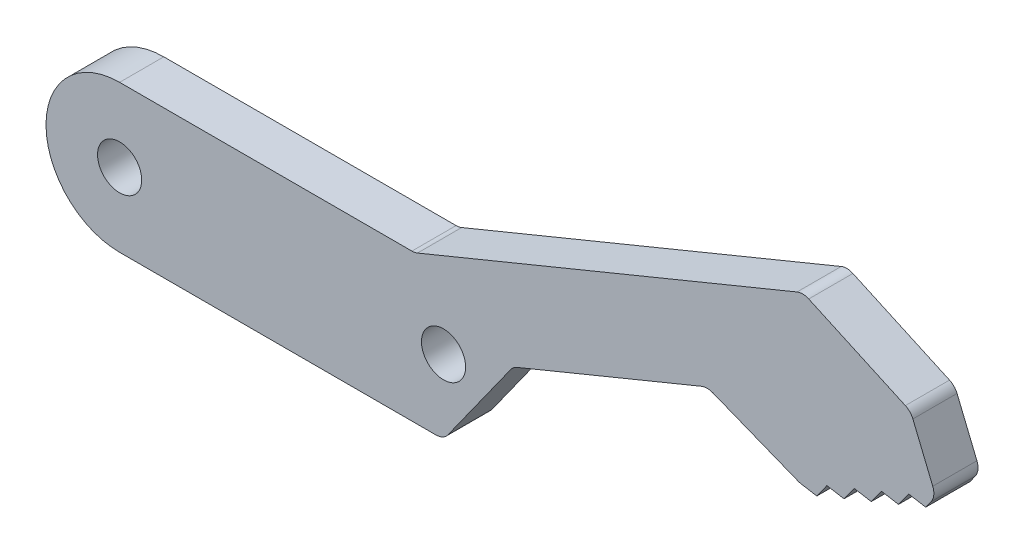
ISO-10303-21;
HEADER;
FILE_DESCRIPTION(('STEP AP214'),'2;1');
FILE_NAME('part.step','',(''),(''),'','','');
FILE_SCHEMA(('AUTOMOTIVE_DESIGN { 1 0 10303 214 1 1 1 1 }'));
ENDSEC;
DATA;
#1=APPLICATION_CONTEXT('core data for automotive mechanical design processes');
#2=APPLICATION_PROTOCOL_DEFINITION('international standard','automotive_design',2000,#1);
#3=PRODUCT_CONTEXT('',#1,'mechanical');
#4=PRODUCT('Part','Part','',(#3));
#5=PRODUCT_RELATED_PRODUCT_CATEGORY('part','',(#4));
#6=PRODUCT_DEFINITION_FORMATION('','',#4);
#7=PRODUCT_DEFINITION_CONTEXT('part definition',#1,'design');
#8=PRODUCT_DEFINITION('design','',#6,#7);
#9=PRODUCT_DEFINITION_SHAPE('','',#8);
#10=(LENGTH_UNIT() NAMED_UNIT(*) SI_UNIT(.MILLI.,.METRE.));
#11=(NAMED_UNIT(*) PLANE_ANGLE_UNIT() SI_UNIT($,.RADIAN.));
#12=(NAMED_UNIT(*) SI_UNIT($,.STERADIAN.) SOLID_ANGLE_UNIT());
#13=UNCERTAINTY_MEASURE_WITH_UNIT(LENGTH_MEASURE(1.E-05),#10,'distance_accuracy_value','');
#14=(GEOMETRIC_REPRESENTATION_CONTEXT(3) GLOBAL_UNCERTAINTY_ASSIGNED_CONTEXT((#13)) GLOBAL_UNIT_ASSIGNED_CONTEXT((#10,
#11,#12)) REPRESENTATION_CONTEXT('',''));
#15=CARTESIAN_POINT('',(0.,0.,0.));
#16=DIRECTION('',(0.,0.,1.));
#17=DIRECTION('',(1.,0.,0.));
#18=AXIS2_PLACEMENT_3D('',#15,#16,#17);
#19=CARTESIAN_POINT('',(16.9314341640704,-12.0952117619831,3.));
#20=DIRECTION('',(0.813703233651604,-0.581280523968353,0.));
#21=DIRECTION('',(0.581280523968353,0.813703233651604,0.));
#22=AXIS2_PLACEMENT_3D('',#19,#20,#21);
#23=PLANE('',#22);
#24=DIRECTION('',(-0.581280523968353,-0.813703233651604,0.));
#25=VECTOR('',#24,1.);
#26=CARTESIAN_POINT('',(16.9314341640704,-12.0952117619831,0.));
#27=LINE('',#26,#25);
#28=CARTESIAN_POINT('',(26.562618493048,1.38696338278467,0.));
#29=VERTEX_POINT('',#28);
#30=CARTESIAN_POINT('',(22.2991182366711,-4.58128052396835,0.));
#31=VERTEX_POINT('',#30);
#32=EDGE_CURVE('E368',#29,#31,#27,.T.);
#33=ORIENTED_EDGE('',*,*,#32,.F.);
#34=DIRECTION('',(0.,0.,-1.));
#35=VECTOR('',#34,1.);
#36=CARTESIAN_POINT('',(26.562618493048,1.38696338278467,3.));
#37=LINE('',#36,#35);
#38=CARTESIAN_POINT('',(26.562618493048,1.38696338278467,3.));
#39=VERTEX_POINT('',#38);
#40=EDGE_CURVE('E347',#29,#39,#37,.F.);
#41=ORIENTED_EDGE('',*,*,#40,.T.);
#42=DIRECTION('',(-0.581280523968353,-0.813703233651604,0.));
#43=VECTOR('',#42,1.);
#44=CARTESIAN_POINT('',(16.9314341640704,-12.0952117619831,3.));
#45=LINE('',#44,#43);
#46=CARTESIAN_POINT('',(22.2991182366711,-4.58128052396835,3.));
#47=VERTEX_POINT('',#46);
#48=EDGE_CURVE('E387',#39,#47,#45,.T.);
#49=ORIENTED_EDGE('',*,*,#48,.T.);
#50=DIRECTION('',(0.,0.,-1.));
#51=VECTOR('',#50,1.);
#52=CARTESIAN_POINT('',(22.2991182366711,-4.58128052396835,0.));
#53=LINE('',#52,#51);
#54=EDGE_CURVE('E343',#47,#31,#53,.T.);
#55=ORIENTED_EDGE('',*,*,#54,.T.);
#56=EDGE_LOOP('',(#33,#41,#49,#55));
#57=FACE_BOUND('',#56,.T.);
#58=ADVANCED_FACE('F51',(#57),#23,.T.);
#59=CARTESIAN_POINT('',(3.29500338314039,-8.01412070884607,3.));
#60=DIRECTION('',(0.380263412733207,-0.924878228166549,0.));
#61=DIRECTION('',(0.924878228166549,0.380263412733207,0.));
#62=AXIS2_PLACEMENT_3D('',#59,#60,#61);
#63=PLANE('',#62);
#64=DIRECTION('',(-0.924878228166549,-0.380263412733207,0.));
#65=VECTOR('',#64,1.);
#66=CARTESIAN_POINT('',(3.29500338314039,-8.01412070884607,0.));
#67=LINE('',#66,#65);
#68=CARTESIAN_POINT('',(39.5264893293259,6.88244413040183,0.));
#69=VERTEX_POINT('',#68);
#70=CARTESIAN_POINT('',(26.9960583139664,1.73056108698286,0.));
#71=VERTEX_POINT('',#70);
#72=EDGE_CURVE('E370',#69,#71,#67,.T.);
#73=ORIENTED_EDGE('',*,*,#72,.F.);
#74=DIRECTION('',(0.,0.,-1.));
#75=VECTOR('',#74,1.);
#76=CARTESIAN_POINT('',(39.5264893293259,6.88244413040184,3.));
#77=LINE('',#76,#75);
#78=CARTESIAN_POINT('',(39.5264893293259,6.88244413040183,3.));
#79=VERTEX_POINT('',#78);
#80=EDGE_CURVE('E340',#69,#79,#77,.F.);
#81=ORIENTED_EDGE('',*,*,#80,.T.);
#82=DIRECTION('',(-0.924878228166549,-0.380263412733207,0.));
#83=VECTOR('',#82,1.);
#84=CARTESIAN_POINT('',(3.29500338314039,-8.01412070884607,3.));
#85=LINE('',#84,#83);
#86=CARTESIAN_POINT('',(26.9960583139664,1.73056108698286,3.));
#87=VERTEX_POINT('',#86);
#88=EDGE_CURVE('E385',#79,#87,#85,.T.);
#89=ORIENTED_EDGE('',*,*,#88,.T.);
#90=DIRECTION('',(0.,0.,-1.));
#91=VECTOR('',#90,1.);
#92=CARTESIAN_POINT('',(26.9960583139664,1.73056108698286,0.));
#93=LINE('',#92,#91);
#94=EDGE_CURVE('E336',#87,#71,#93,.T.);
#95=ORIENTED_EDGE('',*,*,#94,.T.);
#96=EDGE_LOOP('',(#73,#81,#89,#95));
#97=FACE_BOUND('',#96,.T.);
#98=ADVANCED_FACE('F389',(#97),#63,.T.);
#99=CARTESIAN_POINT('',(7.84369243763637,19.7605066346556,3.));
#100=DIRECTION('',(-0.368935795459582,-0.929454882621317,0.));
#101=DIRECTION('',(0.929454882621317,-0.368935795459582,0.));
#102=AXIS2_PLACEMENT_3D('',#99,#100,#101);
#103=PLANE('',#102);
#104=DIRECTION('',(-0.929454882621317,0.368935795459582,0.));
#105=VECTOR('',#104,1.);
#106=CARTESIAN_POINT('',(7.84369243763637,19.7605066346556,0.));
#107=LINE('',#106,#105);
#108=CARTESIAN_POINT('',(46.0908425261848,4.57876623410547,0.));
#109=VERTEX_POINT('',#108);
#110=CARTESIAN_POINT('',(40.2756885375187,6.8870207848566,0.));
#111=VERTEX_POINT('',#110);
#112=EDGE_CURVE('E463',#109,#111,#107,.T.);
#113=ORIENTED_EDGE('',*,*,#112,.F.);
#114=DIRECTION('',(0.,0.,-1.));
#115=VECTOR('',#114,1.);
#116=CARTESIAN_POINT('',(46.0908425261848,4.57876623410548,3.));
#117=LINE('',#116,#115);
#118=CARTESIAN_POINT('',(46.0908425261848,4.57876623410547,3.));
#119=VERTEX_POINT('',#118);
#120=EDGE_CURVE('E291',#109,#119,#117,.F.);
#121=ORIENTED_EDGE('',*,*,#120,.T.);
#122=DIRECTION('',(-0.929454882621317,0.368935795459582,0.));
#123=VECTOR('',#122,1.);
#124=CARTESIAN_POINT('',(7.84369243763637,19.7605066346556,3.));
#125=LINE('',#124,#123);
#126=CARTESIAN_POINT('',(40.2756885375187,6.8870207848566,3.));
#127=VERTEX_POINT('',#126);
#128=EDGE_CURVE('E246',#119,#127,#125,.T.);
#129=ORIENTED_EDGE('',*,*,#128,.T.);
#130=DIRECTION('',(0.,0.,-1.));
#131=VECTOR('',#130,1.);
#132=CARTESIAN_POINT('',(40.2756885375187,6.8870207848566,0.));
#133=LINE('',#132,#131);
#134=EDGE_CURVE('E287',#127,#111,#133,.T.);
#135=ORIENTED_EDGE('',*,*,#134,.T.);
#136=EDGE_LOOP('',(#113,#121,#129,#135));
#137=FACE_BOUND('',#136,.T.);
#138=ADVANCED_FACE('F643',(#137),#103,.T.);
#139=CARTESIAN_POINT('',(2.04998063607053,12.0493696274544,3.));
#140=DIRECTION('',(0.167721751487352,0.985834374567054,0.));
#141=DIRECTION('',(-0.985834374567054,0.167721751487352,0.));
#142=AXIS2_PLACEMENT_3D('',#139,#140,#141);
#143=PLANE('',#142);
#144=DIRECTION('',(0.985834374567054,-0.167721751487352,0.));
#145=VECTOR('',#144,1.);
#146=CARTESIAN_POINT('',(2.04998063607053,12.0493696274544,3.));
#147=LINE('',#146,#145);
#148=CARTESIAN_POINT('',(46.2920565701571,4.52238674215974,3.));
#149=VERTEX_POINT('',#148);
#150=CARTESIAN_POINT('',(47.3510308865052,4.3422215625919,3.));
#151=VERTEX_POINT('',#150);
#152=EDGE_CURVE('E232',#149,#151,#147,.T.);
#153=ORIENTED_EDGE('',*,*,#152,.F.);
#154=DIRECTION('',(0.,0.,-1.));
#155=VECTOR('',#154,1.);
#156=CARTESIAN_POINT('',(46.2920565701571,4.52238674215974,0.));
#157=LINE('',#156,#155);
#158=CARTESIAN_POINT('',(46.2920565701571,4.52238674215974,0.));
#159=VERTEX_POINT('',#158);
#160=EDGE_CURVE('E263',#149,#159,#157,.T.);
#161=ORIENTED_EDGE('',*,*,#160,.T.);
#162=DIRECTION('',(0.985834374567054,-0.167721751487352,0.));
#163=VECTOR('',#162,1.);
#164=CARTESIAN_POINT('',(2.04998063607053,12.0493696274544,0.));
#165=LINE('',#164,#163);
#166=CARTESIAN_POINT('',(47.3510308865052,4.3422215625919,0.));
#167=VERTEX_POINT('',#166);
#168=EDGE_CURVE('E260',#159,#167,#165,.T.);
#169=ORIENTED_EDGE('',*,*,#168,.T.);
#170=DIRECTION('',(0.,0.,-1.));
#171=VECTOR('',#170,1.);
#172=CARTESIAN_POINT('',(47.3510308865052,4.3422215625919,3.));
#173=LINE('',#172,#171);
#174=EDGE_CURVE('E252',#151,#167,#173,.T.);
#175=ORIENTED_EDGE('',*,*,#174,.F.);
#176=EDGE_LOOP('',(#153,#161,#169,#175));
#177=FACE_BOUND('',#176,.T.);
#178=ADVANCED_FACE('F258',(#177),#143,.F.);
#179=CARTESIAN_POINT('',(29.2140395089282,-20.9496267653803,3.));
#180=DIRECTION('',(-0.812647209633238,0.582755963225871,0.));
#181=DIRECTION('',(-0.582755963225871,-0.812647209633238,0.));
#182=AXIS2_PLACEMENT_3D('',#179,#180,#181);
#183=PLANE('',#182);
#184=DIRECTION('',(0.582755963225871,0.812647209633238,0.));
#185=VECTOR('',#184,1.);
#186=CARTESIAN_POINT('',(29.2140395089282,-20.9496267653803,0.));
#187=LINE('',#186,#185);
#188=CARTESIAN_POINT('',(48.0382444817135,5.3005338679292,0.));
#189=VERTEX_POINT('',#188);
#190=EDGE_CURVE('E469',#167,#189,#187,.T.);
#191=ORIENTED_EDGE('',*,*,#190,.T.);
#192=DIRECTION('',(0.,0.,-1.));
#193=VECTOR('',#192,1.);
#194=CARTESIAN_POINT('',(48.0382444817135,5.3005338679292,3.));
#195=LINE('',#194,#193);
#196=CARTESIAN_POINT('',(48.0382444817135,5.3005338679292,3.));
#197=VERTEX_POINT('',#196);
#198=EDGE_CURVE('E254',#197,#189,#195,.T.);
#199=ORIENTED_EDGE('',*,*,#198,.F.);
#200=DIRECTION('',(0.582755963225871,0.812647209633238,0.));
#201=VECTOR('',#200,1.);
#202=CARTESIAN_POINT('',(29.2140395089282,-20.9496267653803,3.));
#203=LINE('',#202,#201);
#204=EDGE_CURVE('E237',#151,#197,#203,.T.);
#205=ORIENTED_EDGE('',*,*,#204,.F.);
#206=ORIENTED_EDGE('',*,*,#174,.T.);
#207=EDGE_LOOP('',(#191,#199,#205,#206));
#208=FACE_BOUND('',#207,.T.);
#209=ADVANCED_FACE('F251',(#208),#183,.F.);
#210=CARTESIAN_POINT('',(2.22776533707793,13.0943519745326,3.));
#211=DIRECTION('',(0.167721751487345,0.985834374567055,0.));
#212=DIRECTION('',(-0.985834374567056,0.167721751487345,0.));
#213=AXIS2_PLACEMENT_3D('',#210,#211,#212);
#214=PLANE('',#213);
#215=DIRECTION('',(0.985834374567055,-0.167721751487345,0.));
#216=VECTOR('',#215,1.);
#217=CARTESIAN_POINT('',(2.22776533707793,13.0943519745326,0.));
#218=LINE('',#217,#216);
#219=CARTESIAN_POINT('',(49.2007873428382,5.10274838805831,0.));
#220=VERTEX_POINT('',#219);
#221=EDGE_CURVE('E472',#189,#220,#218,.T.);
#222=ORIENTED_EDGE('',*,*,#221,.T.);
#223=DIRECTION('',(0.,0.,-1.));
#224=VECTOR('',#223,1.);
#225=CARTESIAN_POINT('',(49.2007873428382,5.10274838805831,3.));
#226=LINE('',#225,#224);
#227=CARTESIAN_POINT('',(49.2007873428382,5.10274838805831,3.));
#228=VERTEX_POINT('',#227);
#229=EDGE_CURVE('E269',#228,#220,#226,.T.);
#230=ORIENTED_EDGE('',*,*,#229,.F.);
#231=DIRECTION('',(0.985834374567055,-0.167721751487345,0.));
#232=VECTOR('',#231,1.);
#233=CARTESIAN_POINT('',(2.22776533707793,13.0943519745326,3.));
#234=LINE('',#233,#232);
#235=EDGE_CURVE('E256',#197,#228,#234,.T.);
#236=ORIENTED_EDGE('',*,*,#235,.F.);
#237=ORIENTED_EDGE('',*,*,#198,.T.);
#238=EDGE_LOOP('',(#222,#230,#236,#237));
#239=FACE_BOUND('',#238,.T.);
#240=ADVANCED_FACE('F564',(#239),#214,.F.);
#241=CARTESIAN_POINT('',(30.0754438283324,-21.5673468509608,3.));
#242=DIRECTION('',(-0.812647209633237,0.582755963225872,0.));
#243=DIRECTION('',(-0.582755963225872,-0.812647209633237,0.));
#244=AXIS2_PLACEMENT_3D('',#241,#242,#243);
#245=PLANE('',#244);
#246=DIRECTION('',(0.582755963225872,0.812647209633237,0.));
#247=VECTOR('',#246,1.);
#248=CARTESIAN_POINT('',(30.0754438283324,-21.5673468509608,0.));
#249=LINE('',#248,#247);
#250=CARTESIAN_POINT('',(49.8880009380465,6.06106069339562,0.));
#251=VERTEX_POINT('',#250);
#252=EDGE_CURVE('E476',#220,#251,#249,.T.);
#253=ORIENTED_EDGE('',*,*,#252,.T.);
#254=DIRECTION('',(0.,0.,-1.));
#255=VECTOR('',#254,1.);
#256=CARTESIAN_POINT('',(49.8880009380465,6.06106069339562,3.));
#257=LINE('',#256,#255);
#258=CARTESIAN_POINT('',(49.8880009380465,6.06106069339562,3.));
#259=VERTEX_POINT('',#258);
#260=EDGE_CURVE('E554',#259,#251,#257,.T.);
#261=ORIENTED_EDGE('',*,*,#260,.F.);
#262=DIRECTION('',(0.582755963225872,0.812647209633237,0.));
#263=VECTOR('',#262,1.);
#264=CARTESIAN_POINT('',(30.0754438283324,-21.5673468509608,3.));
#265=LINE('',#264,#263);
#266=EDGE_CURVE('E403',#228,#259,#265,.T.);
#267=ORIENTED_EDGE('',*,*,#266,.F.);
#268=ORIENTED_EDGE('',*,*,#229,.T.);
#269=EDGE_LOOP('',(#253,#261,#267,#268));
#270=FACE_BOUND('',#269,.T.);
#271=ADVANCED_FACE('F561',(#270),#245,.F.);
#272=CARTESIAN_POINT('',(2.40555003808549,14.1393343216111,3.));
#273=DIRECTION('',(0.167721751487346,0.985834374567055,0.));
#274=DIRECTION('',(-0.985834374567055,0.167721751487346,0.));
#275=AXIS2_PLACEMENT_3D('',#272,#273,#274);
#276=PLANE('',#275);
#277=DIRECTION('',(0.985834374567055,-0.167721751487346,0.));
#278=VECTOR('',#277,1.);
#279=CARTESIAN_POINT('',(2.40555003808549,14.1393343216111,0.));
#280=LINE('',#279,#278);
#281=CARTESIAN_POINT('',(51.0505437991714,5.86327521352473,0.));
#282=VERTEX_POINT('',#281);
#283=EDGE_CURVE('E480',#251,#282,#280,.T.);
#284=ORIENTED_EDGE('',*,*,#283,.T.);
#285=DIRECTION('',(0.,0.,-1.));
#286=VECTOR('',#285,1.);
#287=CARTESIAN_POINT('',(51.0505437991714,5.86327521352473,3.));
#288=LINE('',#287,#286);
#289=CARTESIAN_POINT('',(51.0505437991714,5.86327521352473,3.));
#290=VERTEX_POINT('',#289);
#291=EDGE_CURVE('E550',#290,#282,#288,.T.);
#292=ORIENTED_EDGE('',*,*,#291,.F.);
#293=DIRECTION('',(0.985834374567055,-0.167721751487346,0.));
#294=VECTOR('',#293,1.);
#295=CARTESIAN_POINT('',(2.40555003808549,14.1393343216111,3.));
#296=LINE('',#295,#294);
#297=EDGE_CURVE('E407',#259,#290,#296,.T.);
#298=ORIENTED_EDGE('',*,*,#297,.F.);
#299=ORIENTED_EDGE('',*,*,#260,.T.);
#300=EDGE_LOOP('',(#284,#292,#298,#299));
#301=FACE_BOUND('',#300,.T.);
#302=ADVANCED_FACE('F567',(#301),#276,.F.);
#303=CARTESIAN_POINT('',(30.9368481477369,-22.1850669365412,3.));
#304=DIRECTION('',(-0.812647209633239,0.582755963225869,0.));
#305=DIRECTION('',(-0.582755963225869,-0.812647209633239,0.));
#306=AXIS2_PLACEMENT_3D('',#303,#304,#305);
#307=PLANE('',#306);
#308=DIRECTION('',(0.582755963225869,0.812647209633239,0.));
#309=VECTOR('',#308,1.);
#310=CARTESIAN_POINT('',(30.9368481477369,-22.1850669365412,0.));
#311=LINE('',#310,#309);
#312=CARTESIAN_POINT('',(51.7377573943796,6.82158751886203,0.));
#313=VERTEX_POINT('',#312);
#314=EDGE_CURVE('E484',#282,#313,#311,.T.);
#315=ORIENTED_EDGE('',*,*,#314,.T.);
#316=DIRECTION('',(0.,0.,-1.));
#317=VECTOR('',#316,1.);
#318=CARTESIAN_POINT('',(51.7377573943796,6.82158751886203,3.));
#319=LINE('',#318,#317);
#320=CARTESIAN_POINT('',(51.7377573943796,6.82158751886203,3.));
#321=VERTEX_POINT('',#320);
#322=EDGE_CURVE('E546',#321,#313,#319,.T.);
#323=ORIENTED_EDGE('',*,*,#322,.F.);
#324=DIRECTION('',(0.582755963225869,0.812647209633239,0.));
#325=VECTOR('',#324,1.);
#326=CARTESIAN_POINT('',(30.9368481477369,-22.1850669365412,3.));
#327=LINE('',#326,#325);
#328=EDGE_CURVE('E411',#290,#321,#327,.T.);
#329=ORIENTED_EDGE('',*,*,#328,.F.);
#330=ORIENTED_EDGE('',*,*,#291,.T.);
#331=EDGE_LOOP('',(#315,#323,#329,#330));
#332=FACE_BOUND('',#331,.T.);
#333=ADVANCED_FACE('F571',(#332),#307,.F.);
#334=CARTESIAN_POINT('',(2.58333473909304,15.1843166686896,3.));
#335=DIRECTION('',(0.167721751487346,0.985834374567055,0.));
#336=DIRECTION('',(-0.985834374567055,0.167721751487346,0.));
#337=AXIS2_PLACEMENT_3D('',#334,#335,#336);
#338=PLANE('',#337);
#339=DIRECTION('',(0.985834374567055,-0.167721751487346,0.));
#340=VECTOR('',#339,1.);
#341=CARTESIAN_POINT('',(2.58333473909304,15.1843166686896,0.));
#342=LINE('',#341,#340);
#343=CARTESIAN_POINT('',(52.9003002555045,6.62380203899114,0.));
#344=VERTEX_POINT('',#343);
#345=EDGE_CURVE('E488',#313,#344,#342,.T.);
#346=ORIENTED_EDGE('',*,*,#345,.T.);
#347=DIRECTION('',(0.,0.,-1.));
#348=VECTOR('',#347,1.);
#349=CARTESIAN_POINT('',(52.9003002555045,6.62380203899114,3.));
#350=LINE('',#349,#348);
#351=CARTESIAN_POINT('',(52.9003002555045,6.62380203899114,3.));
#352=VERTEX_POINT('',#351);
#353=EDGE_CURVE('E542',#352,#344,#350,.T.);
#354=ORIENTED_EDGE('',*,*,#353,.F.);
#355=DIRECTION('',(0.985834374567055,-0.167721751487346,0.));
#356=VECTOR('',#355,1.);
#357=CARTESIAN_POINT('',(2.58333473909304,15.1843166686896,3.));
#358=LINE('',#357,#356);
#359=EDGE_CURVE('E415',#321,#352,#358,.T.);
#360=ORIENTED_EDGE('',*,*,#359,.F.);
#361=ORIENTED_EDGE('',*,*,#322,.T.);
#362=EDGE_LOOP('',(#346,#354,#360,#361));
#363=FACE_BOUND('',#362,.T.);
#364=ADVANCED_FACE('F573',(#363),#338,.F.);
#365=CARTESIAN_POINT('',(31.7982524671406,-22.8027870221219,3.));
#366=DIRECTION('',(-0.812647209633232,0.582755963225879,0.));
#367=DIRECTION('',(-0.582755963225879,-0.812647209633232,0.));
#368=AXIS2_PLACEMENT_3D('',#365,#366,#367);
#369=PLANE('',#368);
#370=DIRECTION('',(0.582755963225879,0.812647209633232,0.));
#371=VECTOR('',#370,1.);
#372=CARTESIAN_POINT('',(31.7982524671406,-22.8027870221219,0.));
#373=LINE('',#372,#371);
#374=CARTESIAN_POINT('',(53.5875138507128,7.58211434432844,0.));
#375=VERTEX_POINT('',#374);
#376=EDGE_CURVE('E492',#344,#375,#373,.T.);
#377=ORIENTED_EDGE('',*,*,#376,.T.);
#378=DIRECTION('',(0.,0.,-1.));
#379=VECTOR('',#378,1.);
#380=CARTESIAN_POINT('',(53.5875138507128,7.58211434432844,3.));
#381=LINE('',#380,#379);
#382=CARTESIAN_POINT('',(53.5875138507128,7.58211434432844,3.));
#383=VERTEX_POINT('',#382);
#384=EDGE_CURVE('E538',#383,#375,#381,.T.);
#385=ORIENTED_EDGE('',*,*,#384,.F.);
#386=DIRECTION('',(0.582755963225879,0.812647209633232,0.));
#387=VECTOR('',#386,1.);
#388=CARTESIAN_POINT('',(31.7982524671406,-22.8027870221219,3.));
#389=LINE('',#388,#387);
#390=EDGE_CURVE('E419',#352,#383,#389,.T.);
#391=ORIENTED_EDGE('',*,*,#390,.F.);
#392=ORIENTED_EDGE('',*,*,#353,.T.);
#393=EDGE_LOOP('',(#377,#385,#391,#392));
#394=FACE_BOUND('',#393,.T.);
#395=ADVANCED_FACE('F575',(#394),#369,.F.);
#396=CARTESIAN_POINT('',(2.7611194401007,16.2292990157683,3.));
#397=DIRECTION('',(0.167721751487351,0.985834374567054,0.));
#398=DIRECTION('',(-0.985834374567055,0.167721751487351,0.));
#399=AXIS2_PLACEMENT_3D('',#396,#397,#398);
#400=PLANE('',#399);
#401=DIRECTION('',(0.985834374567055,-0.167721751487351,0.));
#402=VECTOR('',#401,1.);
#403=CARTESIAN_POINT('',(2.7611194401007,16.2292990157683,0.));
#404=LINE('',#403,#402);
#405=CARTESIAN_POINT('',(54.7500567118375,7.38432886445755,0.));
#406=VERTEX_POINT('',#405);
#407=EDGE_CURVE('E496',#375,#406,#404,.T.);
#408=ORIENTED_EDGE('',*,*,#407,.T.);
#409=DIRECTION('',(0.,0.,-1.));
#410=VECTOR('',#409,1.);
#411=CARTESIAN_POINT('',(54.7500567118375,7.38432886445755,3.));
#412=LINE('',#411,#410);
#413=CARTESIAN_POINT('',(54.7500567118375,7.38432886445755,3.));
#414=VERTEX_POINT('',#413);
#415=EDGE_CURVE('E534',#414,#406,#412,.T.);
#416=ORIENTED_EDGE('',*,*,#415,.F.);
#417=DIRECTION('',(0.985834374567055,-0.167721751487351,0.));
#418=VECTOR('',#417,1.);
#419=CARTESIAN_POINT('',(2.7611194401007,16.2292990157683,3.));
#420=LINE('',#419,#418);
#421=EDGE_CURVE('E423',#383,#414,#420,.T.);
#422=ORIENTED_EDGE('',*,*,#421,.F.);
#423=ORIENTED_EDGE('',*,*,#384,.T.);
#424=EDGE_LOOP('',(#408,#416,#422,#423));
#425=FACE_BOUND('',#424,.T.);
#426=ADVANCED_FACE('F580',(#425),#400,.F.);
#427=CARTESIAN_POINT('',(32.6596567865455,-23.4205071077022,3.));
#428=DIRECTION('',(-0.812647209633238,0.58275596322587,0.));
#429=DIRECTION('',(-0.58275596322587,-0.812647209633238,0.));
#430=AXIS2_PLACEMENT_3D('',#427,#428,#429);
#431=PLANE('',#430);
#432=DIRECTION('',(0.58275596322587,0.812647209633238,0.));
#433=VECTOR('',#432,1.);
#434=CARTESIAN_POINT('',(32.6596567865455,-23.4205071077022,0.));
#435=LINE('',#434,#433);
#436=CARTESIAN_POINT('',(55.1142791888537,7.89223337047834,0.));
#437=VERTEX_POINT('',#436);
#438=EDGE_CURVE('E500',#406,#437,#435,.T.);
#439=ORIENTED_EDGE('',*,*,#438,.T.);
#440=DIRECTION('',(0.,0.,-1.));
#441=VECTOR('',#440,1.);
#442=CARTESIAN_POINT('',(55.1142791888537,7.89223337047834,3.));
#443=LINE('',#442,#441);
#444=CARTESIAN_POINT('',(55.1142791888537,7.89223337047834,3.));
#445=VERTEX_POINT('',#444);
#446=EDGE_CURVE('E315',#437,#445,#443,.F.);
#447=ORIENTED_EDGE('',*,*,#446,.T.);
#448=DIRECTION('',(0.58275596322587,0.812647209633238,0.));
#449=VECTOR('',#448,1.);
#450=CARTESIAN_POINT('',(32.6596567865455,-23.4205071077022,3.));
#451=LINE('',#450,#449);
#452=EDGE_CURVE('E427',#414,#445,#451,.T.);
#453=ORIENTED_EDGE('',*,*,#452,.F.);
#454=ORIENTED_EDGE('',*,*,#415,.T.);
#455=EDGE_LOOP('',(#439,#447,#453,#454));
#456=FACE_BOUND('',#455,.T.);
#457=ADVANCED_FACE('F582',(#456),#431,.F.);
#458=CARTESIAN_POINT('',(50.3551112402657,20.7034892439219,3.));
#459=DIRECTION('',(0.924878228166549,0.380263412733207,0.));
#460=DIRECTION('',(-0.380263412733207,0.924878228166549,0.));
#461=AXIS2_PLACEMENT_3D('',#458,#459,#460);
#462=PLANE('',#461);
#463=DIRECTION('',(0.380263412733207,-0.924878228166549,0.));
#464=VECTOR('',#463,1.);
#465=CARTESIAN_POINT('',(50.3551112402657,20.7034892439219,3.));
#466=LINE('',#465,#464);
#467=CARTESIAN_POINT('',(53.8764912996726,12.138774256918,3.));
#468=VERTEX_POINT('',#467);
#469=CARTESIAN_POINT('',(55.226510207387,8.85525274643741,3.));
#470=VERTEX_POINT('',#469);
#471=EDGE_CURVE('E431',#468,#470,#466,.T.);
#472=ORIENTED_EDGE('',*,*,#471,.T.);
#473=DIRECTION('',(0.,0.,-1.));
#474=VECTOR('',#473,1.);
#475=CARTESIAN_POINT('',(55.226510207387,8.85525274643742,0.));
#476=LINE('',#475,#474);
#477=CARTESIAN_POINT('',(55.226510207387,8.85525274643741,0.));
#478=VERTEX_POINT('',#477);
#479=EDGE_CURVE('E311',#470,#478,#476,.T.);
#480=ORIENTED_EDGE('',*,*,#479,.T.);
#481=DIRECTION('',(0.380263412733207,-0.924878228166549,0.));
#482=VECTOR('',#481,1.);
#483=CARTESIAN_POINT('',(50.3551112402657,20.7034892439219,0.));
#484=LINE('',#483,#482);
#485=CARTESIAN_POINT('',(53.8764912996726,12.138774256918,0.));
#486=VERTEX_POINT('',#485);
#487=EDGE_CURVE('E504',#486,#478,#484,.T.);
#488=ORIENTED_EDGE('',*,*,#487,.F.);
#489=DIRECTION('',(0.,0.,-1.));
#490=VECTOR('',#489,1.);
#491=CARTESIAN_POINT('',(53.8764912996726,12.138774256918,3.));
#492=LINE('',#491,#490);
#493=EDGE_CURVE('E308',#486,#468,#492,.F.);
#494=ORIENTED_EDGE('',*,*,#493,.T.);
#495=EDGE_LOOP('',(#472,#480,#488,#494));
#496=FACE_BOUND('',#495,.T.);
#497=ADVANCED_FACE('F590',(#496),#462,.T.);
#498=CARTESIAN_POINT('',(13.9488099268582,30.6231164748253,3.));
#499=DIRECTION('',(0.414522259932085,0.910039172794664,0.));
#500=DIRECTION('',(-0.910039172794664,0.414522259932085,0.));
#501=AXIS2_PLACEMENT_3D('',#498,#499,#500);
#502=PLANE('',#501);
#503=DIRECTION('',(0.910039172794664,-0.414522259932085,0.));
#504=VECTOR('',#503,1.);
#505=CARTESIAN_POINT('',(13.9488099268582,30.6231164748253,3.));
#506=LINE('',#505,#504);
#507=CARTESIAN_POINT('',(46.8032086062433,15.6579589338968,3.));
#508=VERTEX_POINT('',#507);
#509=CARTESIAN_POINT('',(53.3661353314382,12.6685500169795,3.));
#510=VERTEX_POINT('',#509);
#511=EDGE_CURVE('E435',#508,#510,#506,.T.);
#512=ORIENTED_EDGE('',*,*,#511,.T.);
#513=DIRECTION('',(0.,0.,-1.));
#514=VECTOR('',#513,1.);
#515=CARTESIAN_POINT('',(53.3661353314382,12.6685500169795,3.));
#516=LINE('',#515,#514);
#517=CARTESIAN_POINT('',(53.3661353314382,12.6685500169795,0.));
#518=VERTEX_POINT('',#517);
#519=EDGE_CURVE('E321',#510,#518,#516,.T.);
#520=ORIENTED_EDGE('',*,*,#519,.T.);
#521=DIRECTION('',(0.910039172794664,-0.414522259932085,0.));
#522=VECTOR('',#521,1.);
#523=CARTESIAN_POINT('',(13.9488099268582,30.6231164748253,0.));
#524=LINE('',#523,#522);
#525=CARTESIAN_POINT('',(46.8032086062433,15.6579589338968,0.));
#526=VERTEX_POINT('',#525);
#527=EDGE_CURVE('E508',#526,#518,#524,.T.);
#528=ORIENTED_EDGE('',*,*,#527,.F.);
#529=DIRECTION('',(0.,0.,-1.));
#530=VECTOR('',#529,1.);
#531=CARTESIAN_POINT('',(46.8032086062433,15.6579589338968,3.));
#532=LINE('',#531,#530);
#533=EDGE_CURVE('E318',#526,#508,#532,.F.);
#534=ORIENTED_EDGE('',*,*,#533,.T.);
#535=EDGE_LOOP('',(#512,#520,#528,#534));
#536=FACE_BOUND('',#535,.T.);
#537=ADVANCED_FACE('F599',(#536),#502,.T.);
#538=CARTESIAN_POINT('',(1.14074851739701,-2.77453321099285,3.));
#539=DIRECTION('',(-0.380263412733206,0.924878228166549,0.));
#540=DIRECTION('',(-0.924878228166549,-0.380263412733206,0.));
#541=AXIS2_PLACEMENT_3D('',#538,#539,#540);
#542=PLANE('',#541);
#543=DIRECTION('',(0.924878228166549,0.380263412733206,0.));
#544=VECTOR('',#543,1.);
#545=CARTESIAN_POINT('',(1.14074851739701,-2.77453321099285,3.));
#546=LINE('',#545,#544);
#547=CARTESIAN_POINT('',(20.2327114807882,5.07512177183345,3.));
#548=VERTEX_POINT('',#547);
#549=CARTESIAN_POINT('',(46.0084229335781,15.6727979892687,3.));
#550=VERTEX_POINT('',#549);
#551=EDGE_CURVE('E439',#548,#550,#546,.T.);
#552=ORIENTED_EDGE('',*,*,#551,.T.);
#553=DIRECTION('',(0.,0.,-1.));
#554=VECTOR('',#553,1.);
#555=CARTESIAN_POINT('',(46.0084229335781,15.6727979892687,3.));
#556=LINE('',#555,#554);
#557=CARTESIAN_POINT('',(46.0084229335781,15.6727979892687,0.));
#558=VERTEX_POINT('',#557);
#559=EDGE_CURVE('E328',#550,#558,#556,.T.);
#560=ORIENTED_EDGE('',*,*,#559,.T.);
#561=DIRECTION('',(0.924878228166549,0.380263412733206,0.));
#562=VECTOR('',#561,1.);
#563=CARTESIAN_POINT('',(1.14074851739701,-2.77453321099285,0.));
#564=LINE('',#563,#562);
#565=CARTESIAN_POINT('',(20.2327114807882,5.07512177183345,0.));
#566=VERTEX_POINT('',#565);
#567=EDGE_CURVE('E512',#566,#558,#564,.T.);
#568=ORIENTED_EDGE('',*,*,#567,.F.);
#569=DIRECTION('',(0.,0.,-1.));
#570=VECTOR('',#569,1.);
#571=CARTESIAN_POINT('',(20.2327114807882,5.07512177183345,3.));
#572=LINE('',#571,#570);
#573=EDGE_CURVE('E325',#566,#548,#572,.F.);
#574=ORIENTED_EDGE('',*,*,#573,.T.);
#575=EDGE_LOOP('',(#552,#560,#568,#574));
#576=FACE_BOUND('',#575,.T.);
#577=ADVANCED_FACE('F606',(#576),#542,.T.);
#578=CARTESIAN_POINT('',(0.,5.,3.));
#579=DIRECTION('',(0.,1.,0.));
#580=DIRECTION('',(0.,0.,1.));
#581=AXIS2_PLACEMENT_3D('',#578,#579,#580);
#582=PLANE('',#581);
#583=DIRECTION('',(1.,0.,0.));
#584=VECTOR('',#583,1.);
#585=CARTESIAN_POINT('',(0.,5.,3.));
#586=LINE('',#585,#584);
#587=CARTESIAN_POINT('',(0.,5.,3.));
#588=VERTEX_POINT('',#587);
#589=CARTESIAN_POINT('',(19.852448068055,5.,3.));
#590=VERTEX_POINT('',#589);
#591=EDGE_CURVE('E443',#588,#590,#586,.T.);
#592=ORIENTED_EDGE('',*,*,#591,.T.);
#593=DIRECTION('',(0.,0.,-1.));
#594=VECTOR('',#593,1.);
#595=CARTESIAN_POINT('',(19.852448068055,5.,0.));
#596=LINE('',#595,#594);
#597=CARTESIAN_POINT('',(19.852448068055,5.,0.));
#598=VERTEX_POINT('',#597);
#599=EDGE_CURVE('E332',#590,#598,#596,.T.);
#600=ORIENTED_EDGE('',*,*,#599,.T.);
#601=DIRECTION('',(1.,0.,0.));
#602=VECTOR('',#601,1.);
#603=CARTESIAN_POINT('',(0.,5.,0.));
#604=LINE('',#603,#602);
#605=CARTESIAN_POINT('',(0.,5.,0.));
#606=VERTEX_POINT('',#605);
#607=EDGE_CURVE('E516',#606,#598,#604,.T.);
#608=ORIENTED_EDGE('',*,*,#607,.F.);
#609=DIRECTION('',(0.,0.,-1.));
#610=VECTOR('',#609,1.);
#611=CARTESIAN_POINT('',(0.,5.,3.));
#612=LINE('',#611,#610);
#613=EDGE_CURVE('E531',#588,#606,#612,.T.);
#614=ORIENTED_EDGE('',*,*,#613,.F.);
#615=EDGE_LOOP('',(#592,#600,#608,#614));
#616=FACE_BOUND('',#615,.T.);
#617=ADVANCED_FACE('F614',(#616),#582,.T.);
#618=CARTESIAN_POINT('',(0.,0.,3.));
#619=DIRECTION('',(0.,0.,-1.));
#620=DIRECTION('',(-1.,0.,0.));
#621=AXIS2_PLACEMENT_3D('',#618,#619,#620);
#622=CYLINDRICAL_SURFACE('',#621,5.);
#623=CARTESIAN_POINT('',(0.,0.,0.));
#624=DIRECTION('',(0.,0.,1.));
#625=DIRECTION('',(1.,0.,0.));
#626=AXIS2_PLACEMENT_3D('',#623,#624,#625);
#627=CIRCLE('',#626,5.);
#628=CARTESIAN_POINT('',(0.,-5.,0.));
#629=VERTEX_POINT('',#628);
#630=EDGE_CURVE('E520',#606,#629,#627,.T.);
#631=ORIENTED_EDGE('',*,*,#630,.T.);
#632=DIRECTION('',(0.,0.,-1.));
#633=VECTOR('',#632,1.);
#634=CARTESIAN_POINT('',(0.,-5.,3.));
#635=LINE('',#634,#633);
#636=CARTESIAN_POINT('',(0.,-5.,3.));
#637=VERTEX_POINT('',#636);
#638=EDGE_CURVE('E453',#637,#629,#635,.T.);
#639=ORIENTED_EDGE('',*,*,#638,.F.);
#640=CARTESIAN_POINT('',(0.,0.,3.));
#641=DIRECTION('',(0.,0.,1.));
#642=DIRECTION('',(1.,0.,0.));
#643=AXIS2_PLACEMENT_3D('',#640,#641,#642);
#644=CIRCLE('',#643,5.);
#645=EDGE_CURVE('E446',#588,#637,#644,.T.);
#646=ORIENTED_EDGE('',*,*,#645,.F.);
#647=ORIENTED_EDGE('',*,*,#613,.T.);
#648=EDGE_LOOP('',(#631,#639,#646,#647));
#649=FACE_BOUND('',#648,.T.);
#650=ADVANCED_FACE('F618',(#649),#622,.T.);
#651=CARTESIAN_POINT('',(0.,0.,3.));
#652=DIRECTION('',(0.,0.,-1.));
#653=DIRECTION('',(-1.,0.,0.));
#654=AXIS2_PLACEMENT_3D('',#651,#652,#653);
#655=CYLINDRICAL_SURFACE('',#654,1.5);
#656=CARTESIAN_POINT('',(0.,0.,3.));
#657=DIRECTION('',(0.,0.,1.));
#658=DIRECTION('',(1.,0.,0.));
#659=AXIS2_PLACEMENT_3D('',#656,#657,#658);
#660=CIRCLE('',#659,1.5);
#661=CARTESIAN_POINT('',(1.5,0.,3.));
#662=VERTEX_POINT('',#661);
#663=EDGE_CURVE('E397',#662,#662,#660,.T.);
#664=ORIENTED_EDGE('',*,*,#663,.T.);
#665=EDGE_LOOP('',(#664));
#666=FACE_BOUND('',#665,.T.);
#667=CARTESIAN_POINT('',(0.,0.,0.));
#668=DIRECTION('',(0.,0.,1.));
#669=DIRECTION('',(1.,0.,0.));
#670=AXIS2_PLACEMENT_3D('',#667,#668,#669);
#671=CIRCLE('',#670,1.5);
#672=CARTESIAN_POINT('',(1.5,0.,0.));
#673=VERTEX_POINT('',#672);
#674=EDGE_CURVE('E379',#673,#673,#671,.T.);
#675=ORIENTED_EDGE('',*,*,#674,.F.);
#676=EDGE_LOOP('',(#675));
#677=FACE_BOUND('',#676,.T.);
#678=ADVANCED_FACE('F633',(#666,#677),#655,.F.);
#679=CARTESIAN_POINT('',(22.,0.,3.));
#680=DIRECTION('',(0.,0.,-1.));
#681=DIRECTION('',(-1.,0.,0.));
#682=AXIS2_PLACEMENT_3D('',#679,#680,#681);
#683=CYLINDRICAL_SURFACE('',#682,1.5);
#684=CARTESIAN_POINT('',(22.,0.,3.));
#685=DIRECTION('',(0.,0.,1.));
#686=DIRECTION('',(1.,0.,0.));
#687=AXIS2_PLACEMENT_3D('',#684,#685,#686);
#688=CIRCLE('',#687,1.5);
#689=CARTESIAN_POINT('',(23.5,0.,3.));
#690=VERTEX_POINT('',#689);
#691=EDGE_CURVE('E527',#690,#690,#688,.T.);
#692=ORIENTED_EDGE('',*,*,#691,.T.);
#693=EDGE_LOOP('',(#692));
#694=FACE_BOUND('',#693,.T.);
#695=CARTESIAN_POINT('',(22.,0.,0.));
#696=DIRECTION('',(0.,0.,1.));
#697=DIRECTION('',(1.,0.,0.));
#698=AXIS2_PLACEMENT_3D('',#695,#696,#697);
#699=CIRCLE('',#698,1.5);
#700=CARTESIAN_POINT('',(23.5,0.,0.));
#701=VERTEX_POINT('',#700);
#702=EDGE_CURVE('E454',#701,#701,#699,.T.);
#703=ORIENTED_EDGE('',*,*,#702,.F.);
#704=EDGE_LOOP('',(#703));
#705=FACE_BOUND('',#704,.T.);
#706=ADVANCED_FACE('F624',(#694,#705),#683,.F.);
#707=CARTESIAN_POINT('',(0.,-5.,3.));
#708=DIRECTION('',(0.,1.,0.));
#709=DIRECTION('',(0.,0.,1.));
#710=AXIS2_PLACEMENT_3D('',#707,#708,#709);
#711=PLANE('',#710);
#712=DIRECTION('',(1.,0.,0.));
#713=VECTOR('',#712,1.);
#714=CARTESIAN_POINT('',(0.,-5.,0.));
#715=LINE('',#714,#713);
#716=CARTESIAN_POINT('',(21.4854150030195,-5.,0.));
#717=VERTEX_POINT('',#716);
#718=EDGE_CURVE('E524',#629,#717,#715,.T.);
#719=ORIENTED_EDGE('',*,*,#718,.T.);
#720=DIRECTION('',(0.,0.,-1.));
#721=VECTOR('',#720,1.);
#722=CARTESIAN_POINT('',(21.4854150030195,-5.,3.));
#723=LINE('',#722,#721);
#724=CARTESIAN_POINT('',(21.4854150030195,-5.,3.));
#725=VERTEX_POINT('',#724);
#726=EDGE_CURVE('E67',#717,#725,#723,.F.);
#727=ORIENTED_EDGE('',*,*,#726,.T.);
#728=DIRECTION('',(1.,0.,0.));
#729=VECTOR('',#728,1.);
#730=CARTESIAN_POINT('',(0.,-5.,3.));
#731=LINE('',#730,#729);
#732=EDGE_CURVE('E450',#637,#725,#731,.T.);
#733=ORIENTED_EDGE('',*,*,#732,.F.);
#734=ORIENTED_EDGE('',*,*,#638,.T.);
#735=EDGE_LOOP('',(#719,#727,#733,#734));
#736=FACE_BOUND('',#735,.T.);
#737=ADVANCED_FACE('F622',(#736),#711,.F.);
#738=CARTESIAN_POINT('',(0.,0.,3.));
#739=DIRECTION('',(0.,0.,1.));
#740=DIRECTION('',(1.,0.,0.));
#741=AXIS2_PLACEMENT_3D('',#738,#739,#740);
#742=PLANE('',#741);
#743=ORIENTED_EDGE('',*,*,#691,.F.);
#744=EDGE_LOOP('',(#743));
#745=FACE_BOUND('',#744,.T.);
#746=ORIENTED_EDGE('',*,*,#663,.F.);
#747=EDGE_LOOP('',(#746));
#748=FACE_BOUND('',#747,.T.);
#749=ORIENTED_EDGE('',*,*,#128,.F.);
#750=CARTESIAN_POINT('',(46.4597783216444,5.50822111672679,3.));
#751=DIRECTION('',(0.,0.,1.));
#752=DIRECTION('',(1.,0.,0.));
#753=AXIS2_PLACEMENT_3D('',#750,#751,#752);
#754=CIRCLE('',#753,1.);
#755=EDGE_CURVE('E240',#119,#149,#754,.T.);
#756=ORIENTED_EDGE('',*,*,#755,.T.);
#757=ORIENTED_EDGE('',*,*,#152,.T.);
#758=ORIENTED_EDGE('',*,*,#204,.T.);
#759=ORIENTED_EDGE('',*,*,#235,.T.);
#760=ORIENTED_EDGE('',*,*,#266,.T.);
#761=ORIENTED_EDGE('',*,*,#297,.T.);
#762=ORIENTED_EDGE('',*,*,#328,.T.);
#763=ORIENTED_EDGE('',*,*,#359,.T.);
#764=ORIENTED_EDGE('',*,*,#390,.T.);
#765=ORIENTED_EDGE('',*,*,#421,.T.);
#766=ORIENTED_EDGE('',*,*,#452,.T.);
#767=CARTESIAN_POINT('',(54.3016319792205,8.47498933370421,3.));
#768=DIRECTION('',(0.,0.,1.));
#769=DIRECTION('',(1.,0.,0.));
#770=AXIS2_PLACEMENT_3D('',#767,#768,#769);
#771=CIRCLE('',#770,1.);
#772=EDGE_CURVE('E303',#445,#470,#771,.T.);
#773=ORIENTED_EDGE('',*,*,#772,.T.);
#774=ORIENTED_EDGE('',*,*,#471,.F.);
#775=CARTESIAN_POINT('',(52.9516130715061,11.7585108441848,3.));
#776=DIRECTION('',(0.,0.,1.));
#777=DIRECTION('',(1.,0.,0.));
#778=AXIS2_PLACEMENT_3D('',#775,#776,#777);
#779=CIRCLE('',#778,1.);
#780=EDGE_CURVE('E300',#468,#510,#779,.T.);
#781=ORIENTED_EDGE('',*,*,#780,.T.);
#782=ORIENTED_EDGE('',*,*,#511,.F.);
#783=CARTESIAN_POINT('',(46.3886863463112,14.7479197611021,3.));
#784=DIRECTION('',(0.,0.,1.));
#785=DIRECTION('',(1.,0.,0.));
#786=AXIS2_PLACEMENT_3D('',#783,#784,#785);
#787=CIRCLE('',#786,1.);
#788=EDGE_CURVE('E297',#508,#550,#787,.T.);
#789=ORIENTED_EDGE('',*,*,#788,.T.);
#790=ORIENTED_EDGE('',*,*,#551,.F.);
#791=CARTESIAN_POINT('',(19.852448068055,6.,3.));
#792=DIRECTION('',(0.,0.,1.));
#793=DIRECTION('',(1.,0.,0.));
#794=AXIS2_PLACEMENT_3D('',#791,#792,#793);
#795=CIRCLE('',#794,1.);
#796=EDGE_CURVE('E75',#548,#590,#795,.F.);
#797=ORIENTED_EDGE('',*,*,#796,.T.);
#798=ORIENTED_EDGE('',*,*,#591,.F.);
#799=ORIENTED_EDGE('',*,*,#645,.T.);
#800=ORIENTED_EDGE('',*,*,#732,.T.);
#801=CARTESIAN_POINT('',(21.4854150030195,-4.,3.));
#802=DIRECTION('',(0.,0.,1.));
#803=DIRECTION('',(1.,0.,0.));
#804=AXIS2_PLACEMENT_3D('',#801,#802,#803);
#805=CIRCLE('',#804,1.);
#806=EDGE_CURVE('E294',#725,#47,#805,.T.);
#807=ORIENTED_EDGE('',*,*,#806,.T.);
#808=ORIENTED_EDGE('',*,*,#48,.F.);
#809=CARTESIAN_POINT('',(27.3763217266996,0.805682858816315,3.));
#810=DIRECTION('',(0.,0.,1.));
#811=DIRECTION('',(1.,0.,0.));
#812=AXIS2_PLACEMENT_3D('',#809,#810,#811);
#813=CIRCLE('',#812,1.);
#814=EDGE_CURVE('E11',#39,#87,#813,.F.);
#815=ORIENTED_EDGE('',*,*,#814,.T.);
#816=ORIENTED_EDGE('',*,*,#88,.F.);
#817=CARTESIAN_POINT('',(39.9067527420591,5.95756590223529,3.));
#818=DIRECTION('',(0.,0.,1.));
#819=DIRECTION('',(1.,0.,0.));
#820=AXIS2_PLACEMENT_3D('',#817,#818,#819);
#821=CIRCLE('',#820,1.);
#822=EDGE_CURVE('E360',#79,#127,#821,.F.);
#823=ORIENTED_EDGE('',*,*,#822,.T.);
#824=EDGE_LOOP('',(#749,#756,#757,#758,#759,#760,#761,#762,#763,#764,#765,#766,#773,#774,#781,
#782,#789,#790,#797,#798,#799,#800,#807,#808,#815,#816,#823));
#825=FACE_BOUND('',#824,.T.);
#826=ADVANCED_FACE('F235',(#745,#748,#825),#742,.T.);
#827=CARTESIAN_POINT('',(0.,0.,0.));
#828=DIRECTION('',(0.,0.,1.));
#829=DIRECTION('',(1.,0.,0.));
#830=AXIS2_PLACEMENT_3D('',#827,#828,#829);
#831=PLANE('',#830);
#832=ORIENTED_EDGE('',*,*,#702,.T.);
#833=EDGE_LOOP('',(#832));
#834=FACE_BOUND('',#833,.T.);
#835=ORIENTED_EDGE('',*,*,#674,.T.);
#836=EDGE_LOOP('',(#835));
#837=FACE_BOUND('',#836,.T.);
#838=ORIENTED_EDGE('',*,*,#168,.F.);
#839=CARTESIAN_POINT('',(46.4597783216444,5.50822111672679,0.));
#840=DIRECTION('',(0.,0.,1.));
#841=DIRECTION('',(1.,0.,0.));
#842=AXIS2_PLACEMENT_3D('',#839,#840,#841);
#843=CIRCLE('',#842,1.);
#844=EDGE_CURVE('E284',#159,#109,#843,.F.);
#845=ORIENTED_EDGE('',*,*,#844,.T.);
#846=ORIENTED_EDGE('',*,*,#112,.T.);
#847=CARTESIAN_POINT('',(39.9067527420591,5.95756590223529,0.));
#848=DIRECTION('',(0.,0.,1.));
#849=DIRECTION('',(1.,0.,0.));
#850=AXIS2_PLACEMENT_3D('',#847,#848,#849);
#851=CIRCLE('',#850,1.);
#852=EDGE_CURVE('E357',#111,#69,#851,.T.);
#853=ORIENTED_EDGE('',*,*,#852,.T.);
#854=ORIENTED_EDGE('',*,*,#72,.T.);
#855=CARTESIAN_POINT('',(27.3763217266996,0.805682858816315,0.));
#856=DIRECTION('',(0.,0.,1.));
#857=DIRECTION('',(1.,0.,0.));
#858=AXIS2_PLACEMENT_3D('',#855,#856,#857);
#859=CIRCLE('',#858,1.);
#860=EDGE_CURVE('E60',#71,#29,#859,.T.);
#861=ORIENTED_EDGE('',*,*,#860,.T.);
#862=ORIENTED_EDGE('',*,*,#32,.T.);
#863=CARTESIAN_POINT('',(21.4854150030195,-4.,0.));
#864=DIRECTION('',(0.,0.,1.));
#865=DIRECTION('',(1.,0.,0.));
#866=AXIS2_PLACEMENT_3D('',#863,#864,#865);
#867=CIRCLE('',#866,1.);
#868=EDGE_CURVE('E267',#31,#717,#867,.F.);
#869=ORIENTED_EDGE('',*,*,#868,.T.);
#870=ORIENTED_EDGE('',*,*,#718,.F.);
#871=ORIENTED_EDGE('',*,*,#630,.F.);
#872=ORIENTED_EDGE('',*,*,#607,.T.);
#873=CARTESIAN_POINT('',(19.852448068055,6.,0.));
#874=DIRECTION('',(0.,0.,1.));
#875=DIRECTION('',(1.,0.,0.));
#876=AXIS2_PLACEMENT_3D('',#873,#874,#875);
#877=CIRCLE('',#876,1.);
#878=EDGE_CURVE('E352',#598,#566,#877,.T.);
#879=ORIENTED_EDGE('',*,*,#878,.T.);
#880=ORIENTED_EDGE('',*,*,#567,.T.);
#881=CARTESIAN_POINT('',(46.3886863463112,14.7479197611021,0.));
#882=DIRECTION('',(0.,0.,1.));
#883=DIRECTION('',(1.,0.,0.));
#884=AXIS2_PLACEMENT_3D('',#881,#882,#883);
#885=CIRCLE('',#884,1.);
#886=EDGE_CURVE('E275',#558,#526,#885,.F.);
#887=ORIENTED_EDGE('',*,*,#886,.T.);
#888=ORIENTED_EDGE('',*,*,#527,.T.);
#889=CARTESIAN_POINT('',(52.9516130715061,11.7585108441848,0.));
#890=DIRECTION('',(0.,0.,1.));
#891=DIRECTION('',(1.,0.,0.));
#892=AXIS2_PLACEMENT_3D('',#889,#890,#891);
#893=CIRCLE('',#892,1.);
#894=EDGE_CURVE('E278',#518,#486,#893,.F.);
#895=ORIENTED_EDGE('',*,*,#894,.T.);
#896=ORIENTED_EDGE('',*,*,#487,.T.);
#897=CARTESIAN_POINT('',(54.3016319792205,8.47498933370421,0.));
#898=DIRECTION('',(0.,0.,1.));
#899=DIRECTION('',(1.,0.,0.));
#900=AXIS2_PLACEMENT_3D('',#897,#898,#899);
#901=CIRCLE('',#900,1.);
#902=EDGE_CURVE('E281',#478,#437,#901,.F.);
#903=ORIENTED_EDGE('',*,*,#902,.T.);
#904=ORIENTED_EDGE('',*,*,#438,.F.);
#905=ORIENTED_EDGE('',*,*,#407,.F.);
#906=ORIENTED_EDGE('',*,*,#376,.F.);
#907=ORIENTED_EDGE('',*,*,#345,.F.);
#908=ORIENTED_EDGE('',*,*,#314,.F.);
#909=ORIENTED_EDGE('',*,*,#283,.F.);
#910=ORIENTED_EDGE('',*,*,#252,.F.);
#911=ORIENTED_EDGE('',*,*,#221,.F.);
#912=ORIENTED_EDGE('',*,*,#190,.F.);
#913=EDGE_LOOP('',(#838,#845,#846,#853,#854,#861,#862,#869,#870,#871,#872,#879,#880,#887,#888,
#895,#896,#903,#904,#905,#906,#907,#908,#909,#910,#911,#912));
#914=FACE_BOUND('',#913,.T.);
#915=ADVANCED_FACE('F367',(#834,#837,#914),#831,.F.);
#916=CARTESIAN_POINT('',(46.4597783216444,5.50822111672679,3.));
#917=DIRECTION('',(0.,0.,1.));
#918=DIRECTION('',(1.,0.,0.));
#919=AXIS2_PLACEMENT_3D('',#916,#917,#918);
#920=CYLINDRICAL_SURFACE('',#919,1.);
#921=ORIENTED_EDGE('',*,*,#755,.F.);
#922=ORIENTED_EDGE('',*,*,#120,.F.);
#923=ORIENTED_EDGE('',*,*,#844,.F.);
#924=ORIENTED_EDGE('',*,*,#160,.F.);
#925=EDGE_LOOP('',(#921,#922,#923,#924));
#926=FACE_BOUND('',#925,.T.);
#927=ADVANCED_FACE('F650',(#926),#920,.T.);
#928=CARTESIAN_POINT('',(54.3016319792205,8.47498933370421,3.));
#929=DIRECTION('',(0.,0.,1.));
#930=DIRECTION('',(1.,0.,0.));
#931=AXIS2_PLACEMENT_3D('',#928,#929,#930);
#932=CYLINDRICAL_SURFACE('',#931,1.);
#933=ORIENTED_EDGE('',*,*,#772,.F.);
#934=ORIENTED_EDGE('',*,*,#446,.F.);
#935=ORIENTED_EDGE('',*,*,#902,.F.);
#936=ORIENTED_EDGE('',*,*,#479,.F.);
#937=EDGE_LOOP('',(#933,#934,#935,#936));
#938=FACE_BOUND('',#937,.T.);
#939=ADVANCED_FACE('F585',(#938),#932,.T.);
#940=CARTESIAN_POINT('',(52.9516130715061,11.7585108441848,3.));
#941=DIRECTION('',(0.,0.,-1.));
#942=DIRECTION('',(-1.,0.,0.));
#943=AXIS2_PLACEMENT_3D('',#940,#941,#942);
#944=CYLINDRICAL_SURFACE('',#943,1.);
#945=ORIENTED_EDGE('',*,*,#780,.F.);
#946=ORIENTED_EDGE('',*,*,#493,.F.);
#947=ORIENTED_EDGE('',*,*,#894,.F.);
#948=ORIENTED_EDGE('',*,*,#519,.F.);
#949=EDGE_LOOP('',(#945,#946,#947,#948));
#950=FACE_BOUND('',#949,.T.);
#951=ADVANCED_FACE('F594',(#950),#944,.T.);
#952=CARTESIAN_POINT('',(46.3886863463112,14.7479197611021,3.));
#953=DIRECTION('',(0.,0.,-1.));
#954=DIRECTION('',(-1.,0.,0.));
#955=AXIS2_PLACEMENT_3D('',#952,#953,#954);
#956=CYLINDRICAL_SURFACE('',#955,1.);
#957=ORIENTED_EDGE('',*,*,#788,.F.);
#958=ORIENTED_EDGE('',*,*,#533,.F.);
#959=ORIENTED_EDGE('',*,*,#886,.F.);
#960=ORIENTED_EDGE('',*,*,#559,.F.);
#961=EDGE_LOOP('',(#957,#958,#959,#960));
#962=FACE_BOUND('',#961,.T.);
#963=ADVANCED_FACE('F603',(#962),#956,.T.);
#964=CARTESIAN_POINT('',(19.852448068055,6.,3.));
#965=DIRECTION('',(0.,0.,1.));
#966=DIRECTION('',(1.,0.,0.));
#967=AXIS2_PLACEMENT_3D('',#964,#965,#966);
#968=CYLINDRICAL_SURFACE('',#967,1.);
#969=ORIENTED_EDGE('',*,*,#796,.F.);
#970=ORIENTED_EDGE('',*,*,#573,.F.);
#971=ORIENTED_EDGE('',*,*,#878,.F.);
#972=ORIENTED_EDGE('',*,*,#599,.F.);
#973=EDGE_LOOP('',(#969,#970,#971,#972));
#974=FACE_BOUND('',#973,.T.);
#975=ADVANCED_FACE('F610',(#974),#968,.F.);
#976=CARTESIAN_POINT('',(39.9067527420591,5.95756590223529,3.));
#977=DIRECTION('',(0.,0.,1.));
#978=DIRECTION('',(1.,0.,0.));
#979=AXIS2_PLACEMENT_3D('',#976,#977,#978);
#980=CYLINDRICAL_SURFACE('',#979,1.);
#981=ORIENTED_EDGE('',*,*,#822,.F.);
#982=ORIENTED_EDGE('',*,*,#80,.F.);
#983=ORIENTED_EDGE('',*,*,#852,.F.);
#984=ORIENTED_EDGE('',*,*,#134,.F.);
#985=EDGE_LOOP('',(#981,#982,#983,#984));
#986=FACE_BOUND('',#985,.T.);
#987=ADVANCED_FACE('F662',(#986),#980,.F.);
#988=CARTESIAN_POINT('',(27.3763217266996,0.805682858816315,3.));
#989=DIRECTION('',(0.,0.,1.));
#990=DIRECTION('',(1.,0.,0.));
#991=AXIS2_PLACEMENT_3D('',#988,#989,#990);
#992=CYLINDRICAL_SURFACE('',#991,1.);
#993=ORIENTED_EDGE('',*,*,#814,.F.);
#994=ORIENTED_EDGE('',*,*,#40,.F.);
#995=ORIENTED_EDGE('',*,*,#860,.F.);
#996=ORIENTED_EDGE('',*,*,#94,.F.);
#997=EDGE_LOOP('',(#993,#994,#995,#996));
#998=FACE_BOUND('',#997,.T.);
#999=ADVANCED_FACE('F382',(#998),#992,.F.);
#1000=CARTESIAN_POINT('',(21.4854150030195,-4.,3.));
#1001=DIRECTION('',(0.,0.,1.));
#1002=DIRECTION('',(1.,0.,0.));
#1003=AXIS2_PLACEMENT_3D('',#1000,#1001,#1002);
#1004=CYLINDRICAL_SURFACE('',#1003,1.);
#1005=ORIENTED_EDGE('',*,*,#806,.F.);
#1006=ORIENTED_EDGE('',*,*,#726,.F.);
#1007=ORIENTED_EDGE('',*,*,#868,.F.);
#1008=ORIENTED_EDGE('',*,*,#54,.F.);
#1009=EDGE_LOOP('',(#1005,#1006,#1007,#1008));
#1010=FACE_BOUND('',#1009,.T.);
#1011=ADVANCED_FACE('F53',(#1010),#1004,.T.);
#1012=CLOSED_SHELL('',(#58,#98,#138,#178,#209,#240,#271,#302,#333,#364,#395,#426,#457,#497,#537,
#577,#617,#650,#678,#706,#737,#826,#915,#927,#939,#951,#963,#975,#987,#999,#1011));
#1013=MANIFOLD_SOLID_BREP('B2',#1012);
#1014=ADVANCED_BREP_SHAPE_REPRESENTATION('',(#18,#1013),#14);
#1015=SHAPE_DEFINITION_REPRESENTATION(#9,#1014);
ENDSEC;
END-ISO-10303-21;
